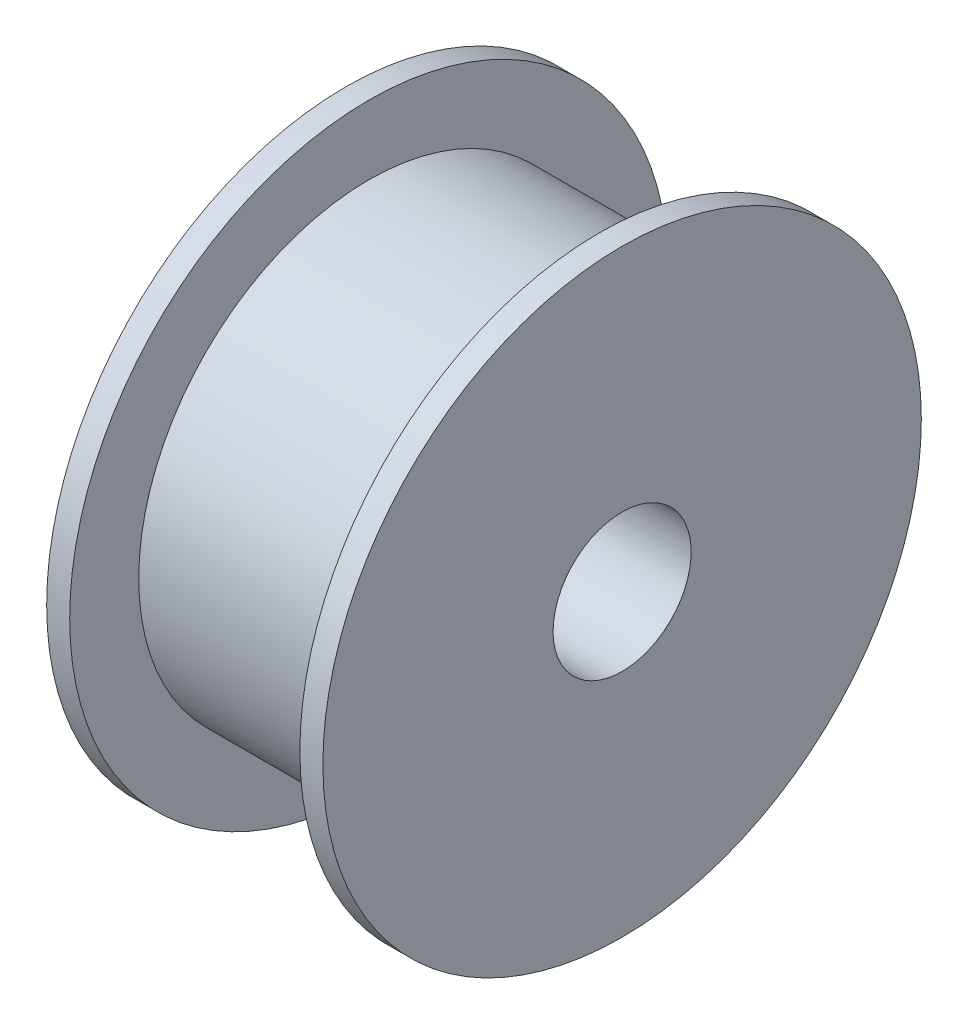
ISO-10303-21;
HEADER;
FILE_DESCRIPTION(('STEP AP214'),'2;1');
FILE_NAME('part.step','',(''),(''),'','','');
FILE_SCHEMA(('AUTOMOTIVE_DESIGN { 1 0 10303 214 1 1 1 1 }'));
ENDSEC;
DATA;
#1=APPLICATION_CONTEXT('core data for automotive mechanical design processes');
#2=APPLICATION_PROTOCOL_DEFINITION('international standard','automotive_design',2000,#1);
#3=PRODUCT_CONTEXT('',#1,'mechanical');
#4=PRODUCT('Part','Part','',(#3));
#5=PRODUCT_RELATED_PRODUCT_CATEGORY('part','',(#4));
#6=PRODUCT_DEFINITION_FORMATION('','',#4);
#7=PRODUCT_DEFINITION_CONTEXT('part definition',#1,'design');
#8=PRODUCT_DEFINITION('design','',#6,#7);
#9=PRODUCT_DEFINITION_SHAPE('','',#8);
#10=(LENGTH_UNIT() NAMED_UNIT(*) SI_UNIT(.MILLI.,.METRE.));
#11=(NAMED_UNIT(*) PLANE_ANGLE_UNIT() SI_UNIT($,.RADIAN.));
#12=(NAMED_UNIT(*) SI_UNIT($,.STERADIAN.) SOLID_ANGLE_UNIT());
#13=UNCERTAINTY_MEASURE_WITH_UNIT(LENGTH_MEASURE(1.E-05),#10,'distance_accuracy_value','');
#14=(GEOMETRIC_REPRESENTATION_CONTEXT(3) GLOBAL_UNCERTAINTY_ASSIGNED_CONTEXT((#13)) GLOBAL_UNIT_ASSIGNED_CONTEXT((#10,
#11,#12)) REPRESENTATION_CONTEXT('',''));
#15=CARTESIAN_POINT('',(0.,0.,0.));
#16=DIRECTION('',(0.,0.,1.));
#17=DIRECTION('',(1.,0.,0.));
#18=AXIS2_PLACEMENT_3D('',#15,#16,#17);
#19=CARTESIAN_POINT('',(-6.,3.,0.));
#20=DIRECTION('',(1.,0.,0.));
#21=DIRECTION('',(0.,0.,-1.));
#22=AXIS2_PLACEMENT_3D('',#19,#20,#21);
#23=PLANE('',#22);
#24=CARTESIAN_POINT('',(-6.,-10.,0.));
#25=DIRECTION('',(-1.,0.,0.));
#26=DIRECTION('',(0.,0.,1.));
#27=AXIS2_PLACEMENT_3D('',#24,#25,#26);
#28=CIRCLE('',#27,3.);
#29=CARTESIAN_POINT('',(-6.,-10.,3.));
#30=VERTEX_POINT('',#29);
#31=EDGE_CURVE('E57',#30,#30,#28,.T.);
#32=ORIENTED_EDGE('',*,*,#31,.F.);
#33=EDGE_LOOP('',(#32));
#34=FACE_BOUND('',#33,.T.);
#35=CARTESIAN_POINT('',(-6.,-10.,0.));
#36=DIRECTION('',(-1.,0.,0.));
#37=DIRECTION('',(0.,0.,1.));
#38=AXIS2_PLACEMENT_3D('',#35,#36,#37);
#39=CIRCLE('',#38,13.);
#40=CARTESIAN_POINT('',(-6.,-10.,13.));
#41=VERTEX_POINT('',#40);
#42=EDGE_CURVE('E53',#41,#41,#39,.T.);
#43=ORIENTED_EDGE('',*,*,#42,.T.);
#44=EDGE_LOOP('',(#43));
#45=FACE_BOUND('',#44,.T.);
#46=ADVANCED_FACE('F31',(#34,#45),#23,.F.);
#47=CARTESIAN_POINT('',(6.,3.,0.));
#48=DIRECTION('',(-1.,0.,0.));
#49=DIRECTION('',(0.,0.,1.));
#50=AXIS2_PLACEMENT_3D('',#47,#48,#49);
#51=PLANE('',#50);
#52=CARTESIAN_POINT('',(6.,-10.,0.));
#53=DIRECTION('',(-1.,0.,0.));
#54=DIRECTION('',(0.,0.,1.));
#55=AXIS2_PLACEMENT_3D('',#52,#53,#54);
#56=CIRCLE('',#55,3.);
#57=CARTESIAN_POINT('',(6.,-10.,3.));
#58=VERTEX_POINT('',#57);
#59=EDGE_CURVE('E56',#58,#58,#56,.T.);
#60=ORIENTED_EDGE('',*,*,#59,.T.);
#61=EDGE_LOOP('',(#60));
#62=FACE_BOUND('',#61,.T.);
#63=CARTESIAN_POINT('',(6.,-10.,0.));
#64=DIRECTION('',(-1.,0.,0.));
#65=DIRECTION('',(0.,0.,1.));
#66=AXIS2_PLACEMENT_3D('',#63,#64,#65);
#67=CIRCLE('',#66,13.);
#68=CARTESIAN_POINT('',(6.,-10.,13.));
#69=VERTEX_POINT('',#68);
#70=EDGE_CURVE('E10',#69,#69,#67,.T.);
#71=ORIENTED_EDGE('',*,*,#70,.F.);
#72=EDGE_LOOP('',(#71));
#73=FACE_BOUND('',#72,.T.);
#74=ADVANCED_FACE('F63',(#62,#73),#51,.F.);
#75=CARTESIAN_POINT('',(-6.,-10.,0.));
#76=DIRECTION('',(-1.,0.,0.));
#77=DIRECTION('',(0.,0.,1.));
#78=AXIS2_PLACEMENT_3D('',#75,#76,#77);
#79=CYLINDRICAL_SURFACE('',#78,13.);
#80=CARTESIAN_POINT('',(5.,-10.,0.));
#81=DIRECTION('',(-1.,0.,0.));
#82=DIRECTION('',(0.,0.,1.));
#83=AXIS2_PLACEMENT_3D('',#80,#81,#82);
#84=CIRCLE('',#83,13.);
#85=CARTESIAN_POINT('',(5.,-10.,13.));
#86=VERTEX_POINT('',#85);
#87=EDGE_CURVE('E37',#86,#86,#84,.T.);
#88=ORIENTED_EDGE('',*,*,#87,.F.);
#89=EDGE_LOOP('',(#88));
#90=FACE_BOUND('',#89,.T.);
#91=ORIENTED_EDGE('',*,*,#70,.T.);
#92=EDGE_LOOP('',(#91));
#93=FACE_BOUND('',#92,.T.);
#94=ADVANCED_FACE('F96',(#90,#93),#79,.T.);
#95=CARTESIAN_POINT('',(5.,3.,0.));
#96=DIRECTION('',(1.,0.,0.));
#97=DIRECTION('',(0.,0.,-1.));
#98=AXIS2_PLACEMENT_3D('',#95,#96,#97);
#99=PLANE('',#98);
#100=CARTESIAN_POINT('',(5.,-10.,0.));
#101=DIRECTION('',(-1.,0.,0.));
#102=DIRECTION('',(0.,0.,1.));
#103=AXIS2_PLACEMENT_3D('',#100,#101,#102);
#104=CIRCLE('',#103,10.);
#105=CARTESIAN_POINT('',(5.,-10.,10.));
#106=VERTEX_POINT('',#105);
#107=EDGE_CURVE('E41',#106,#106,#104,.T.);
#108=ORIENTED_EDGE('',*,*,#107,.F.);
#109=EDGE_LOOP('',(#108));
#110=FACE_BOUND('',#109,.T.);
#111=ORIENTED_EDGE('',*,*,#87,.T.);
#112=EDGE_LOOP('',(#111));
#113=FACE_BOUND('',#112,.T.);
#114=ADVANCED_FACE('F91',(#110,#113),#99,.F.);
#115=CARTESIAN_POINT('',(-6.,-10.,0.));
#116=DIRECTION('',(-1.,0.,0.));
#117=DIRECTION('',(0.,0.,1.));
#118=AXIS2_PLACEMENT_3D('',#115,#116,#117);
#119=CYLINDRICAL_SURFACE('',#118,10.);
#120=CARTESIAN_POINT('',(-5.,-10.,0.));
#121=DIRECTION('',(-1.,0.,0.));
#122=DIRECTION('',(0.,0.,1.));
#123=AXIS2_PLACEMENT_3D('',#120,#121,#122);
#124=CIRCLE('',#123,10.);
#125=CARTESIAN_POINT('',(-5.,-10.,10.));
#126=VERTEX_POINT('',#125);
#127=EDGE_CURVE('E45',#126,#126,#124,.T.);
#128=ORIENTED_EDGE('',*,*,#127,.F.);
#129=EDGE_LOOP('',(#128));
#130=FACE_BOUND('',#129,.T.);
#131=ORIENTED_EDGE('',*,*,#107,.T.);
#132=EDGE_LOOP('',(#131));
#133=FACE_BOUND('',#132,.T.);
#134=ADVANCED_FACE('F85',(#130,#133),#119,.T.);
#135=CARTESIAN_POINT('',(-5.,3.,0.));
#136=DIRECTION('',(-1.,0.,0.));
#137=DIRECTION('',(0.,0.,1.));
#138=AXIS2_PLACEMENT_3D('',#135,#136,#137);
#139=PLANE('',#138);
#140=CARTESIAN_POINT('',(-5.,-10.,0.));
#141=DIRECTION('',(-1.,0.,0.));
#142=DIRECTION('',(0.,0.,1.));
#143=AXIS2_PLACEMENT_3D('',#140,#141,#142);
#144=CIRCLE('',#143,13.);
#145=CARTESIAN_POINT('',(-5.,-10.,13.));
#146=VERTEX_POINT('',#145);
#147=EDGE_CURVE('E50',#146,#146,#144,.T.);
#148=ORIENTED_EDGE('',*,*,#147,.F.);
#149=EDGE_LOOP('',(#148));
#150=FACE_BOUND('',#149,.T.);
#151=ORIENTED_EDGE('',*,*,#127,.T.);
#152=EDGE_LOOP('',(#151));
#153=FACE_BOUND('',#152,.T.);
#154=ADVANCED_FACE('F79',(#150,#153),#139,.F.);
#155=CARTESIAN_POINT('',(-6.,-10.,0.));
#156=DIRECTION('',(-1.,0.,0.));
#157=DIRECTION('',(0.,0.,1.));
#158=AXIS2_PLACEMENT_3D('',#155,#156,#157);
#159=CYLINDRICAL_SURFACE('',#158,13.);
#160=ORIENTED_EDGE('',*,*,#42,.F.);
#161=EDGE_LOOP('',(#160));
#162=FACE_BOUND('',#161,.T.);
#163=ORIENTED_EDGE('',*,*,#147,.T.);
#164=EDGE_LOOP('',(#163));
#165=FACE_BOUND('',#164,.T.);
#166=ADVANCED_FACE('F69',(#162,#165),#159,.T.);
#167=CARTESIAN_POINT('',(6.,-10.,0.));
#168=DIRECTION('',(-1.,0.,0.));
#169=DIRECTION('',(0.,0.,1.));
#170=AXIS2_PLACEMENT_3D('',#167,#168,#169);
#171=CYLINDRICAL_SURFACE('',#170,3.);
#172=ORIENTED_EDGE('',*,*,#59,.F.);
#173=EDGE_LOOP('',(#172));
#174=FACE_BOUND('',#173,.T.);
#175=ORIENTED_EDGE('',*,*,#31,.T.);
#176=EDGE_LOOP('',(#175));
#177=FACE_BOUND('',#176,.T.);
#178=ADVANCED_FACE('F66',(#174,#177),#171,.F.);
#179=CLOSED_SHELL('',(#46,#74,#94,#114,#134,#154,#166,#178));
#180=MANIFOLD_SOLID_BREP('B2',#179);
#181=ADVANCED_BREP_SHAPE_REPRESENTATION('',(#18,#180),#14);
#182=SHAPE_DEFINITION_REPRESENTATION(#9,#181);
ENDSEC;
END-ISO-10303-21;
